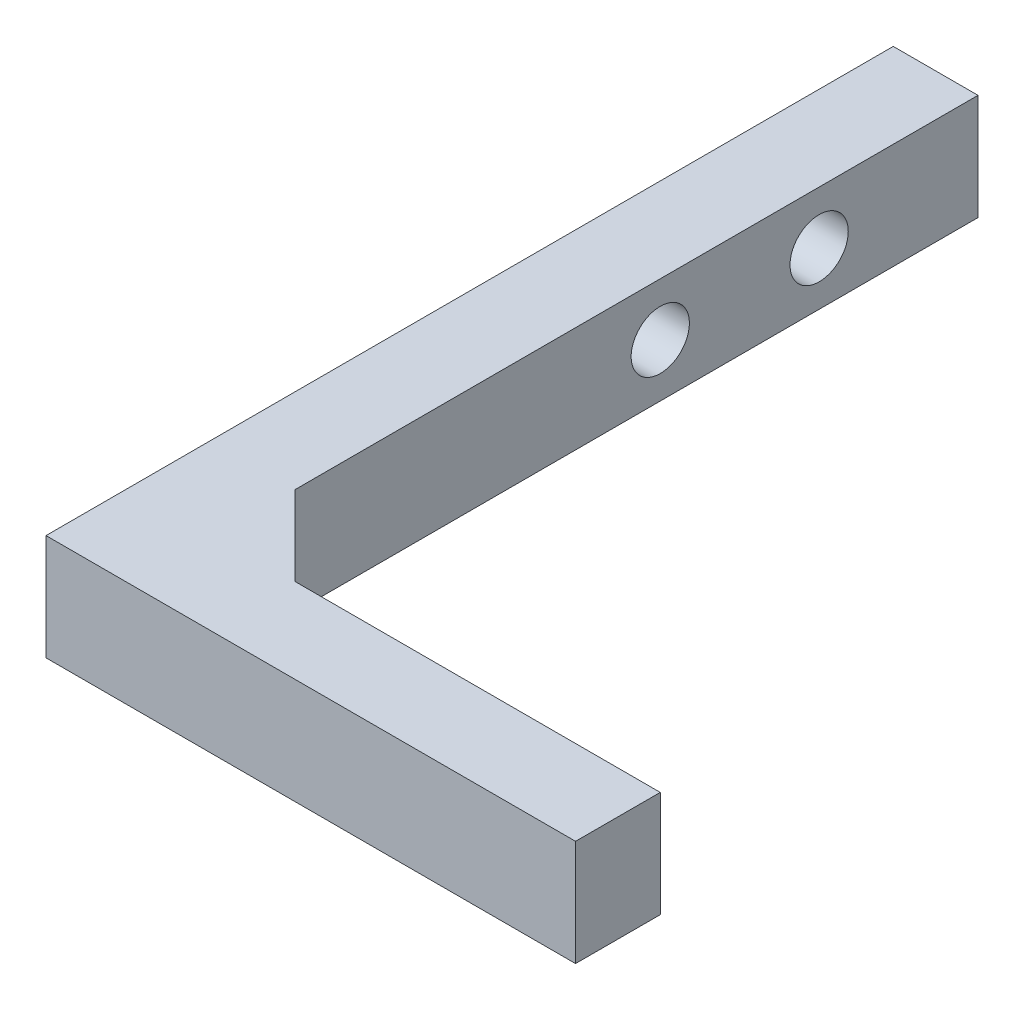
ISO-10303-21;
HEADER;
FILE_DESCRIPTION(('STEP AP214'),'2;1');
FILE_NAME('part.step','',(''),(''),'','','');
FILE_SCHEMA(('AUTOMOTIVE_DESIGN { 1 0 10303 214 1 1 1 1 }'));
ENDSEC;
DATA;
#1=APPLICATION_CONTEXT('core data for automotive mechanical design processes');
#2=APPLICATION_PROTOCOL_DEFINITION('international standard','automotive_design',2000,#1);
#3=PRODUCT_CONTEXT('',#1,'mechanical');
#4=PRODUCT('Part','Part','',(#3));
#5=PRODUCT_RELATED_PRODUCT_CATEGORY('part','',(#4));
#6=PRODUCT_DEFINITION_FORMATION('','',#4);
#7=PRODUCT_DEFINITION_CONTEXT('part definition',#1,'design');
#8=PRODUCT_DEFINITION('design','',#6,#7);
#9=PRODUCT_DEFINITION_SHAPE('','',#8);
#10=(LENGTH_UNIT() NAMED_UNIT(*) SI_UNIT(.MILLI.,.METRE.));
#11=(NAMED_UNIT(*) PLANE_ANGLE_UNIT() SI_UNIT($,.RADIAN.));
#12=(NAMED_UNIT(*) SI_UNIT($,.STERADIAN.) SOLID_ANGLE_UNIT());
#13=UNCERTAINTY_MEASURE_WITH_UNIT(LENGTH_MEASURE(1.E-05),#10,'distance_accuracy_value','');
#14=(GEOMETRIC_REPRESENTATION_CONTEXT(3) GLOBAL_UNCERTAINTY_ASSIGNED_CONTEXT((#13)) GLOBAL_UNIT_ASSIGNED_CONTEXT((#10,
#11,#12)) REPRESENTATION_CONTEXT('',''));
#15=CARTESIAN_POINT('',(0.,0.,0.));
#16=DIRECTION('',(0.,0.,1.));
#17=DIRECTION('',(1.,0.,0.));
#18=AXIS2_PLACEMENT_3D('',#15,#16,#17);
#19=CARTESIAN_POINT('',(0.,10.,12.6978417266187));
#20=DIRECTION('',(0.,0.,-1.));
#21=DIRECTION('',(-1.,0.,0.));
#22=AXIS2_PLACEMENT_3D('',#19,#20,#21);
#23=PLANE('',#22);
#24=DIRECTION('',(1.,0.,0.));
#25=VECTOR('',#24,1.);
#26=CARTESIAN_POINT('',(0.,0.,12.6978417266187));
#27=LINE('',#26,#25);
#28=CARTESIAN_POINT('',(-18.9928057553957,0.,12.6978417266187));
#29=VERTEX_POINT('',#28);
#30=CARTESIAN_POINT('',(31.0071942446043,0.,12.6978417266187));
#31=VERTEX_POINT('',#30);
#32=EDGE_CURVE('E135',#29,#31,#27,.T.);
#33=ORIENTED_EDGE('',*,*,#32,.T.);
#34=DIRECTION('',(0.,-1.,0.));
#35=VECTOR('',#34,1.);
#36=CARTESIAN_POINT('',(31.0071942446043,10.,12.6978417266187));
#37=LINE('',#36,#35);
#38=CARTESIAN_POINT('',(31.0071942446043,10.,12.6978417266187));
#39=VERTEX_POINT('',#38);
#40=EDGE_CURVE('E114',#39,#31,#37,.T.);
#41=ORIENTED_EDGE('',*,*,#40,.F.);
#42=DIRECTION('',(1.,0.,0.));
#43=VECTOR('',#42,1.);
#44=CARTESIAN_POINT('',(0.,10.,12.6978417266187));
#45=LINE('',#44,#43);
#46=CARTESIAN_POINT('',(-18.9928057553957,10.,12.6978417266187));
#47=VERTEX_POINT('',#46);
#48=EDGE_CURVE('E121',#47,#39,#45,.T.);
#49=ORIENTED_EDGE('',*,*,#48,.F.);
#50=DIRECTION('',(0.,-1.,0.));
#51=VECTOR('',#50,1.);
#52=CARTESIAN_POINT('',(-18.9928057553957,10.,12.6978417266187));
#53=LINE('',#52,#51);
#54=EDGE_CURVE('E154',#47,#29,#53,.T.);
#55=ORIENTED_EDGE('',*,*,#54,.T.);
#56=EDGE_LOOP('',(#33,#41,#49,#55));
#57=FACE_BOUND('',#56,.T.);
#58=ADVANCED_FACE('F49',(#57),#23,.F.);
#59=CARTESIAN_POINT('',(31.0071942446043,10.,0.));
#60=DIRECTION('',(-1.,0.,0.));
#61=DIRECTION('',(0.,0.,1.));
#62=AXIS2_PLACEMENT_3D('',#59,#60,#61);
#63=PLANE('',#62);
#64=DIRECTION('',(0.,0.,-1.));
#65=VECTOR('',#64,1.);
#66=CARTESIAN_POINT('',(31.0071942446043,0.,0.));
#67=LINE('',#66,#65);
#68=CARTESIAN_POINT('',(31.0071942446043,0.,4.6978417266187));
#69=VERTEX_POINT('',#68);
#70=EDGE_CURVE('E169',#31,#69,#67,.T.);
#71=ORIENTED_EDGE('',*,*,#70,.T.);
#72=DIRECTION('',(0.,-1.,0.));
#73=VECTOR('',#72,1.);
#74=CARTESIAN_POINT('',(31.0071942446043,10.,4.6978417266187));
#75=LINE('',#74,#73);
#76=CARTESIAN_POINT('',(31.0071942446043,10.,4.6978417266187));
#77=VERTEX_POINT('',#76);
#78=EDGE_CURVE('E117',#77,#69,#75,.T.);
#79=ORIENTED_EDGE('',*,*,#78,.F.);
#80=DIRECTION('',(0.,0.,-1.));
#81=VECTOR('',#80,1.);
#82=CARTESIAN_POINT('',(31.0071942446043,10.,0.));
#83=LINE('',#82,#81);
#84=EDGE_CURVE('E109',#39,#77,#83,.T.);
#85=ORIENTED_EDGE('',*,*,#84,.F.);
#86=ORIENTED_EDGE('',*,*,#40,.T.);
#87=EDGE_LOOP('',(#71,#79,#85,#86));
#88=FACE_BOUND('',#87,.T.);
#89=ADVANCED_FACE('F112',(#88),#63,.F.);
#90=CARTESIAN_POINT('',(0.,10.,4.6978417266187));
#91=DIRECTION('',(0.,0.,-1.));
#92=DIRECTION('',(-1.,0.,0.));
#93=AXIS2_PLACEMENT_3D('',#90,#91,#92);
#94=PLANE('',#93);
#95=DIRECTION('',(1.,0.,0.));
#96=VECTOR('',#95,1.);
#97=CARTESIAN_POINT('',(0.,0.,4.6978417266187));
#98=LINE('',#97,#96);
#99=CARTESIAN_POINT('',(-3.49280575539572,0.,4.6978417266187));
#100=VERTEX_POINT('',#99);
#101=EDGE_CURVE('E166',#100,#69,#98,.T.);
#102=ORIENTED_EDGE('',*,*,#101,.F.);
#103=DIRECTION('',(0.,1.,0.));
#104=VECTOR('',#103,1.);
#105=CARTESIAN_POINT('',(-3.49280575539572,10.,4.6978417266187));
#106=LINE('',#105,#104);
#107=CARTESIAN_POINT('',(-3.49280575539572,10.,4.6978417266187));
#108=VERTEX_POINT('',#107);
#109=EDGE_CURVE('E66',#100,#108,#106,.T.);
#110=ORIENTED_EDGE('',*,*,#109,.T.);
#111=DIRECTION('',(1.,0.,0.));
#112=VECTOR('',#111,1.);
#113=CARTESIAN_POINT('',(0.,10.,4.6978417266187));
#114=LINE('',#113,#112);
#115=EDGE_CURVE('E120',#108,#77,#114,.T.);
#116=ORIENTED_EDGE('',*,*,#115,.T.);
#117=ORIENTED_EDGE('',*,*,#78,.T.);
#118=EDGE_LOOP('',(#102,#110,#116,#117));
#119=FACE_BOUND('',#118,.T.);
#120=ADVANCED_FACE('F217',(#119),#94,.T.);
#121=CARTESIAN_POINT('',(-10.9928057553957,10.,0.));
#122=DIRECTION('',(1.,0.,0.));
#123=DIRECTION('',(0.,0.,-1.));
#124=AXIS2_PLACEMENT_3D('',#121,#122,#123);
#125=PLANE('',#124);
#126=CARTESIAN_POINT('',(-10.9928057553957,5.,-37.3021582733813));
#127=DIRECTION('',(1.,0.,0.));
#128=DIRECTION('',(0.,0.,-1.));
#129=AXIS2_PLACEMENT_3D('',#126,#127,#128);
#130=CIRCLE('',#129,2.75);
#131=CARTESIAN_POINT('',(-10.9928057553957,5.,-40.0521582733813));
#132=VERTEX_POINT('',#131);
#133=EDGE_CURVE('E195',#132,#132,#130,.T.);
#134=ORIENTED_EDGE('',*,*,#133,.F.);
#135=EDGE_LOOP('',(#134));
#136=FACE_BOUND('',#135,.T.);
#137=CARTESIAN_POINT('',(-10.9928057553957,5.,-52.3021582733813));
#138=DIRECTION('',(1.,0.,0.));
#139=DIRECTION('',(0.,0.,-1.));
#140=AXIS2_PLACEMENT_3D('',#137,#138,#139);
#141=CIRCLE('',#140,2.75);
#142=CARTESIAN_POINT('',(-10.9928057553957,5.,-55.0521582733813));
#143=VERTEX_POINT('',#142);
#144=EDGE_CURVE('E191',#143,#143,#141,.T.);
#145=ORIENTED_EDGE('',*,*,#144,.F.);
#146=EDGE_LOOP('',(#145));
#147=FACE_BOUND('',#146,.T.);
#148=DIRECTION('',(0.,0.,1.));
#149=VECTOR('',#148,1.);
#150=CARTESIAN_POINT('',(-10.9928057553957,10.,0.));
#151=LINE('',#150,#149);
#152=CARTESIAN_POINT('',(-10.9928057553957,10.,-67.3021582733813));
#153=VERTEX_POINT('',#152);
#154=CARTESIAN_POINT('',(-10.9928057553957,10.,-2.80215827338133));
#155=VERTEX_POINT('',#154);
#156=EDGE_CURVE('E181',#153,#155,#151,.T.);
#157=ORIENTED_EDGE('',*,*,#156,.T.);
#158=DIRECTION('',(0.,-1.,0.));
#159=VECTOR('',#158,1.);
#160=CARTESIAN_POINT('',(-10.9928057553957,0.,-2.80215827338133));
#161=LINE('',#160,#159);
#162=CARTESIAN_POINT('',(-10.9928057553957,0.,-2.80215827338133));
#163=VERTEX_POINT('',#162);
#164=EDGE_CURVE('E137',#155,#163,#161,.T.);
#165=ORIENTED_EDGE('',*,*,#164,.T.);
#166=DIRECTION('',(0.,0.,1.));
#167=VECTOR('',#166,1.);
#168=CARTESIAN_POINT('',(-10.9928057553957,0.,0.));
#169=LINE('',#168,#167);
#170=CARTESIAN_POINT('',(-10.9928057553957,0.,-67.3021582733813));
#171=VERTEX_POINT('',#170);
#172=EDGE_CURVE('E163',#171,#163,#169,.T.);
#173=ORIENTED_EDGE('',*,*,#172,.F.);
#174=DIRECTION('',(0.,-1.,0.));
#175=VECTOR('',#174,1.);
#176=CARTESIAN_POINT('',(-10.9928057553957,10.,-67.3021582733813));
#177=LINE('',#176,#175);
#178=EDGE_CURVE('E143',#153,#171,#177,.T.);
#179=ORIENTED_EDGE('',*,*,#178,.F.);
#180=EDGE_LOOP('',(#157,#165,#173,#179));
#181=FACE_BOUND('',#180,.T.);
#182=ADVANCED_FACE('F213',(#136,#147,#181),#125,.T.);
#183=CARTESIAN_POINT('',(0.,10.,-67.3021582733813));
#184=DIRECTION('',(0.,0.,-1.));
#185=DIRECTION('',(-1.,0.,0.));
#186=AXIS2_PLACEMENT_3D('',#183,#184,#185);
#187=PLANE('',#186);
#188=DIRECTION('',(1.,0.,0.));
#189=VECTOR('',#188,1.);
#190=CARTESIAN_POINT('',(0.,0.,-67.3021582733813));
#191=LINE('',#190,#189);
#192=CARTESIAN_POINT('',(-18.9928057553957,0.,-67.3021582733813));
#193=VERTEX_POINT('',#192);
#194=EDGE_CURVE('E159',#193,#171,#191,.T.);
#195=ORIENTED_EDGE('',*,*,#194,.F.);
#196=DIRECTION('',(0.,-1.,0.));
#197=VECTOR('',#196,1.);
#198=CARTESIAN_POINT('',(-18.9928057553957,10.,-67.3021582733813));
#199=LINE('',#198,#197);
#200=CARTESIAN_POINT('',(-18.9928057553957,10.,-67.3021582733813));
#201=VERTEX_POINT('',#200);
#202=EDGE_CURVE('E151',#201,#193,#199,.T.);
#203=ORIENTED_EDGE('',*,*,#202,.F.);
#204=DIRECTION('',(1.,0.,0.));
#205=VECTOR('',#204,1.);
#206=CARTESIAN_POINT('',(0.,10.,-67.3021582733813));
#207=LINE('',#206,#205);
#208=EDGE_CURVE('E177',#201,#153,#207,.T.);
#209=ORIENTED_EDGE('',*,*,#208,.T.);
#210=ORIENTED_EDGE('',*,*,#178,.T.);
#211=EDGE_LOOP('',(#195,#203,#209,#210));
#212=FACE_BOUND('',#211,.T.);
#213=ADVANCED_FACE('F216',(#212),#187,.T.);
#214=CARTESIAN_POINT('',(-18.9928057553957,10.,0.));
#215=DIRECTION('',(1.,0.,0.));
#216=DIRECTION('',(0.,0.,-1.));
#217=AXIS2_PLACEMENT_3D('',#214,#215,#216);
#218=PLANE('',#217);
#219=CARTESIAN_POINT('',(-18.9928057553957,5.,-37.3021582733813));
#220=DIRECTION('',(1.,0.,0.));
#221=DIRECTION('',(0.,0.,-1.));
#222=AXIS2_PLACEMENT_3D('',#219,#220,#221);
#223=CIRCLE('',#222,2.75);
#224=CARTESIAN_POINT('',(-18.9928057553957,5.,-40.0521582733813));
#225=VERTEX_POINT('',#224);
#226=EDGE_CURVE('E174',#225,#225,#223,.T.);
#227=ORIENTED_EDGE('',*,*,#226,.T.);
#228=EDGE_LOOP('',(#227));
#229=FACE_BOUND('',#228,.T.);
#230=CARTESIAN_POINT('',(-18.9928057553957,5.,-52.3021582733813));
#231=DIRECTION('',(1.,0.,0.));
#232=DIRECTION('',(0.,0.,-1.));
#233=AXIS2_PLACEMENT_3D('',#230,#231,#232);
#234=CIRCLE('',#233,2.75);
#235=CARTESIAN_POINT('',(-18.9928057553957,5.,-55.0521582733813));
#236=VERTEX_POINT('',#235);
#237=EDGE_CURVE('E187',#236,#236,#234,.T.);
#238=ORIENTED_EDGE('',*,*,#237,.T.);
#239=EDGE_LOOP('',(#238));
#240=FACE_BOUND('',#239,.T.);
#241=DIRECTION('',(0.,0.,1.));
#242=VECTOR('',#241,1.);
#243=CARTESIAN_POINT('',(-18.9928057553957,0.,0.));
#244=LINE('',#243,#242);
#245=EDGE_CURVE('E132',#193,#29,#244,.T.);
#246=ORIENTED_EDGE('',*,*,#245,.T.);
#247=ORIENTED_EDGE('',*,*,#54,.F.);
#248=DIRECTION('',(0.,0.,1.));
#249=VECTOR('',#248,1.);
#250=CARTESIAN_POINT('',(-18.9928057553957,10.,0.));
#251=LINE('',#250,#249);
#252=EDGE_CURVE('E127',#201,#47,#251,.T.);
#253=ORIENTED_EDGE('',*,*,#252,.F.);
#254=ORIENTED_EDGE('',*,*,#202,.T.);
#255=EDGE_LOOP('',(#246,#247,#253,#254));
#256=FACE_BOUND('',#255,.T.);
#257=ADVANCED_FACE('F203',(#229,#240,#256),#218,.F.);
#258=CARTESIAN_POINT('',(0.,10.,0.));
#259=DIRECTION('',(0.,1.,0.));
#260=DIRECTION('',(0.,0.,1.));
#261=AXIS2_PLACEMENT_3D('',#258,#259,#260);
#262=PLANE('',#261);
#263=ORIENTED_EDGE('',*,*,#48,.T.);
#264=ORIENTED_EDGE('',*,*,#84,.T.);
#265=ORIENTED_EDGE('',*,*,#115,.F.);
#266=DIRECTION('',(0.707106781186544,0.,0.707106781186551));
#267=VECTOR('',#266,1.);
#268=CARTESIAN_POINT('',(-10.9928057553957,10.,-2.80215827338133));
#269=LINE('',#268,#267);
#270=EDGE_CURVE('E11',#108,#155,#269,.F.);
#271=ORIENTED_EDGE('',*,*,#270,.T.);
#272=ORIENTED_EDGE('',*,*,#156,.F.);
#273=ORIENTED_EDGE('',*,*,#208,.F.);
#274=ORIENTED_EDGE('',*,*,#252,.T.);
#275=EDGE_LOOP('',(#263,#264,#265,#271,#272,#273,#274));
#276=FACE_BOUND('',#275,.T.);
#277=ADVANCED_FACE('F124',(#276),#262,.T.);
#278=CARTESIAN_POINT('',(0.,0.,0.));
#279=DIRECTION('',(0.,1.,0.));
#280=DIRECTION('',(0.,0.,1.));
#281=AXIS2_PLACEMENT_3D('',#278,#279,#280);
#282=PLANE('',#281);
#283=ORIENTED_EDGE('',*,*,#32,.F.);
#284=ORIENTED_EDGE('',*,*,#245,.F.);
#285=ORIENTED_EDGE('',*,*,#194,.T.);
#286=ORIENTED_EDGE('',*,*,#172,.T.);
#287=DIRECTION('',(-0.707106781186544,0.,-0.707106781186551));
#288=VECTOR('',#287,1.);
#289=CARTESIAN_POINT('',(-4.09532374100723,0.,4.09532374100719));
#290=LINE('',#289,#288);
#291=EDGE_CURVE('E59',#163,#100,#290,.F.);
#292=ORIENTED_EDGE('',*,*,#291,.T.);
#293=ORIENTED_EDGE('',*,*,#101,.T.);
#294=ORIENTED_EDGE('',*,*,#70,.F.);
#295=EDGE_LOOP('',(#283,#284,#285,#286,#292,#293,#294));
#296=FACE_BOUND('',#295,.T.);
#297=ADVANCED_FACE('F226',(#296),#282,.F.);
#298=CARTESIAN_POINT('',(-10.9928057553957,10.,-2.80215827338133));
#299=DIRECTION('',(0.707106781186551,0.,-0.707106781186544));
#300=DIRECTION('',(0.,1.,0.));
#301=AXIS2_PLACEMENT_3D('',#298,#299,#300);
#302=PLANE('',#301);
#303=ORIENTED_EDGE('',*,*,#270,.F.);
#304=ORIENTED_EDGE('',*,*,#109,.F.);
#305=ORIENTED_EDGE('',*,*,#291,.F.);
#306=ORIENTED_EDGE('',*,*,#164,.F.);
#307=EDGE_LOOP('',(#303,#304,#305,#306));
#308=FACE_BOUND('',#307,.T.);
#309=ADVANCED_FACE('F52',(#308),#302,.T.);
#310=CARTESIAN_POINT('',(-18.9928057553957,5.,-52.3021582733813));
#311=DIRECTION('',(1.,0.,0.));
#312=DIRECTION('',(0.,0.,-1.));
#313=AXIS2_PLACEMENT_3D('',#310,#311,#312);
#314=CYLINDRICAL_SURFACE('',#313,2.75);
#315=ORIENTED_EDGE('',*,*,#237,.F.);
#316=EDGE_LOOP('',(#315));
#317=FACE_BOUND('',#316,.T.);
#318=ORIENTED_EDGE('',*,*,#144,.T.);
#319=EDGE_LOOP('',(#318));
#320=FACE_BOUND('',#319,.T.);
#321=ADVANCED_FACE('F209',(#317,#320),#314,.F.);
#322=CARTESIAN_POINT('',(-18.9928057553957,5.,-37.3021582733813));
#323=DIRECTION('',(1.,0.,0.));
#324=DIRECTION('',(0.,0.,-1.));
#325=AXIS2_PLACEMENT_3D('',#322,#323,#324);
#326=CYLINDRICAL_SURFACE('',#325,2.75);
#327=ORIENTED_EDGE('',*,*,#226,.F.);
#328=EDGE_LOOP('',(#327));
#329=FACE_BOUND('',#328,.T.);
#330=ORIENTED_EDGE('',*,*,#133,.T.);
#331=EDGE_LOOP('',(#330));
#332=FACE_BOUND('',#331,.T.);
#333=ADVANCED_FACE('F206',(#329,#332),#326,.F.);
#334=CLOSED_SHELL('',(#58,#89,#120,#182,#213,#257,#277,#297,#309,#321,#333));
#335=MANIFOLD_SOLID_BREP('B2',#334);
#336=ADVANCED_BREP_SHAPE_REPRESENTATION('',(#18,#335),#14);
#337=SHAPE_DEFINITION_REPRESENTATION(#9,#336);
ENDSEC;
END-ISO-10303-21;
